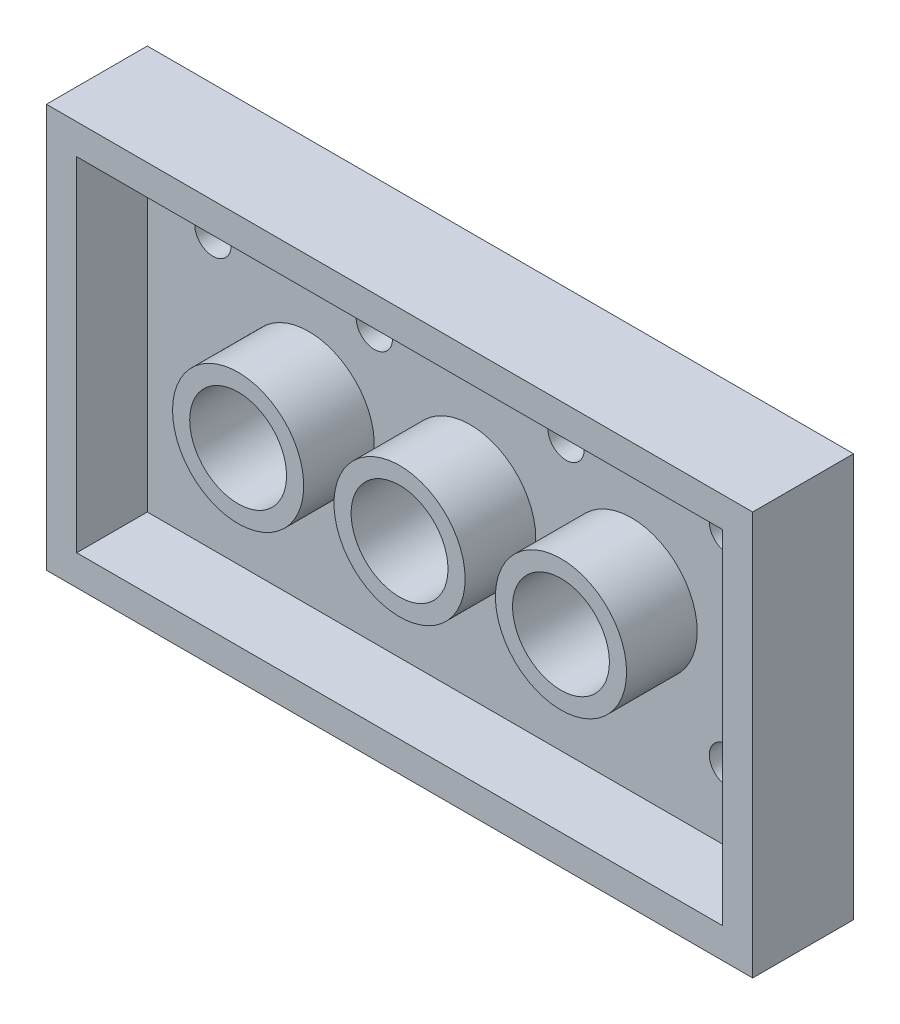
ISO-10303-21;
HEADER;
FILE_DESCRIPTION(('STEP AP214'),'2;1');
FILE_NAME('part.step','',(''),(''),'','','');
FILE_SCHEMA(('AUTOMOTIVE_DESIGN { 1 0 10303 214 1 1 1 1 }'));
ENDSEC;
DATA;
#1=APPLICATION_CONTEXT('core data for automotive mechanical design processes');
#2=APPLICATION_PROTOCOL_DEFINITION('international standard','automotive_design',2000,#1);
#3=PRODUCT_CONTEXT('',#1,'mechanical');
#4=PRODUCT('Part','Part','',(#3));
#5=PRODUCT_RELATED_PRODUCT_CATEGORY('part','',(#4));
#6=PRODUCT_DEFINITION_FORMATION('','',#4);
#7=PRODUCT_DEFINITION_CONTEXT('part definition',#1,'design');
#8=PRODUCT_DEFINITION('design','',#6,#7);
#9=PRODUCT_DEFINITION_SHAPE('','',#8);
#10=(LENGTH_UNIT() NAMED_UNIT(*) SI_UNIT(.MILLI.,.METRE.));
#11=(NAMED_UNIT(*) PLANE_ANGLE_UNIT() SI_UNIT($,.RADIAN.));
#12=(NAMED_UNIT(*) SI_UNIT($,.STERADIAN.) SOLID_ANGLE_UNIT());
#13=UNCERTAINTY_MEASURE_WITH_UNIT(LENGTH_MEASURE(1.E-05),#10,'distance_accuracy_value','');
#14=(GEOMETRIC_REPRESENTATION_CONTEXT(3) GLOBAL_UNCERTAINTY_ASSIGNED_CONTEXT((#13)) GLOBAL_UNIT_ASSIGNED_CONTEXT((#10,
#11,#12)) REPRESENTATION_CONTEXT('',''));
#15=CARTESIAN_POINT('',(0.,0.,0.));
#16=DIRECTION('',(0.,0.,1.));
#17=DIRECTION('',(1.,0.,0.));
#18=AXIS2_PLACEMENT_3D('',#15,#16,#17);
#19=CARTESIAN_POINT('',(0.,0.,1.5));
#20=DIRECTION('',(0.,0.,1.));
#21=DIRECTION('',(1.,0.,0.));
#22=AXIS2_PLACEMENT_3D('',#19,#20,#21);
#23=PLANE('',#22);
#24=CARTESIAN_POINT('',(-12.75,-4.99999999999999,1.5));
#25=DIRECTION('',(0.,0.,1.));
#26=DIRECTION('',(1.,0.,0.));
#27=AXIS2_PLACEMENT_3D('',#24,#25,#26);
#28=CIRCLE('',#27,0.9);
#29=CARTESIAN_POINT('',(-11.85,-4.99999999999999,1.5));
#30=VERTEX_POINT('',#29);
#31=EDGE_CURVE('E222',#30,#30,#28,.F.);
#32=ORIENTED_EDGE('',*,*,#31,.T.);
#33=EDGE_LOOP('',(#32));
#34=FACE_BOUND('',#33,.T.);
#35=CARTESIAN_POINT('',(-4.75,-5.,1.5));
#36=DIRECTION('',(0.,0.,1.));
#37=DIRECTION('',(1.,0.,0.));
#38=AXIS2_PLACEMENT_3D('',#35,#36,#37);
#39=CIRCLE('',#38,0.899999999999999);
#40=CARTESIAN_POINT('',(-3.85,-5.,1.5));
#41=VERTEX_POINT('',#40);
#42=EDGE_CURVE('E230',#41,#41,#39,.F.);
#43=ORIENTED_EDGE('',*,*,#42,.T.);
#44=EDGE_LOOP('',(#43));
#45=FACE_BOUND('',#44,.T.);
#46=CARTESIAN_POINT('',(4.75000000000001,5.,1.5));
#47=DIRECTION('',(0.,0.,-1.));
#48=DIRECTION('',(-1.,0.,0.));
#49=AXIS2_PLACEMENT_3D('',#46,#47,#48);
#50=CIRCLE('',#49,0.899999999999999);
#51=CARTESIAN_POINT('',(3.85000000000001,5.,1.5));
#52=VERTEX_POINT('',#51);
#53=EDGE_CURVE('E231',#52,#52,#50,.T.);
#54=ORIENTED_EDGE('',*,*,#53,.T.);
#55=EDGE_LOOP('',(#54));
#56=FACE_BOUND('',#55,.T.);
#57=CARTESIAN_POINT('',(12.75,5.,1.5));
#58=DIRECTION('',(0.,0.,1.));
#59=DIRECTION('',(1.,0.,0.));
#60=AXIS2_PLACEMENT_3D('',#57,#58,#59);
#61=CIRCLE('',#60,0.9);
#62=CARTESIAN_POINT('',(13.65,5.,1.5));
#63=VERTEX_POINT('',#62);
#64=EDGE_CURVE('E240',#63,#63,#61,.F.);
#65=ORIENTED_EDGE('',*,*,#64,.T.);
#66=EDGE_LOOP('',(#65));
#67=FACE_BOUND('',#66,.T.);
#68=CARTESIAN_POINT('',(-8.,0.,1.5));
#69=DIRECTION('',(0.,0.,1.));
#70=DIRECTION('',(-1.,0.,0.));
#71=AXIS2_PLACEMENT_3D('',#68,#69,#70);
#72=CIRCLE('',#71,3.25);
#73=CARTESIAN_POINT('',(-11.25,0.,1.5));
#74=VERTEX_POINT('',#73);
#75=EDGE_CURVE('E241',#74,#74,#72,.T.);
#76=ORIENTED_EDGE('',*,*,#75,.F.);
#77=EDGE_LOOP('',(#76));
#78=FACE_BOUND('',#77,.T.);
#79=CARTESIAN_POINT('',(8.,0.,1.5));
#80=DIRECTION('',(0.,0.,1.));
#81=DIRECTION('',(1.,0.,0.));
#82=AXIS2_PLACEMENT_3D('',#79,#80,#81);
#83=CIRCLE('',#82,3.25);
#84=CARTESIAN_POINT('',(11.25,0.,1.5));
#85=VERTEX_POINT('',#84);
#86=EDGE_CURVE('E244',#85,#85,#83,.T.);
#87=ORIENTED_EDGE('',*,*,#86,.F.);
#88=EDGE_LOOP('',(#87));
#89=FACE_BOUND('',#88,.T.);
#90=CARTESIAN_POINT('',(0.,0.,1.5));
#91=DIRECTION('',(0.,0.,1.));
#92=DIRECTION('',(1.,0.,0.));
#93=AXIS2_PLACEMENT_3D('',#90,#91,#92);
#94=CIRCLE('',#93,3.25);
#95=CARTESIAN_POINT('',(3.25,0.,1.5));
#96=VERTEX_POINT('',#95);
#97=EDGE_CURVE('E247',#96,#96,#94,.T.);
#98=ORIENTED_EDGE('',*,*,#97,.F.);
#99=EDGE_LOOP('',(#98));
#100=FACE_BOUND('',#99,.T.);
#101=DIRECTION('',(1.,0.,0.));
#102=VECTOR('',#101,1.);
#103=CARTESIAN_POINT('',(-16.,-8.5,1.5));
#104=LINE('',#103,#102);
#105=CARTESIAN_POINT('',(-16.,-8.5,1.5));
#106=VERTEX_POINT('',#105);
#107=CARTESIAN_POINT('',(16.,-8.5,1.5));
#108=VERTEX_POINT('',#107);
#109=EDGE_CURVE('E115',#106,#108,#104,.T.);
#110=ORIENTED_EDGE('',*,*,#109,.T.);
#111=DIRECTION('',(0.,1.,0.));
#112=VECTOR('',#111,1.);
#113=CARTESIAN_POINT('',(16.,-8.5,1.5));
#114=LINE('',#113,#112);
#115=CARTESIAN_POINT('',(16.,8.5,1.5));
#116=VERTEX_POINT('',#115);
#117=EDGE_CURVE('E119',#108,#116,#114,.T.);
#118=ORIENTED_EDGE('',*,*,#117,.T.);
#119=DIRECTION('',(-1.,0.,0.));
#120=VECTOR('',#119,1.);
#121=CARTESIAN_POINT('',(16.,8.5,1.5));
#122=LINE('',#121,#120);
#123=CARTESIAN_POINT('',(-16.,8.5,1.5));
#124=VERTEX_POINT('',#123);
#125=EDGE_CURVE('E57',#116,#124,#122,.T.);
#126=ORIENTED_EDGE('',*,*,#125,.T.);
#127=DIRECTION('',(0.,-1.,0.));
#128=VECTOR('',#127,1.);
#129=CARTESIAN_POINT('',(-16.,8.5,1.5));
#130=LINE('',#129,#128);
#131=EDGE_CURVE('E61',#124,#106,#130,.T.);
#132=ORIENTED_EDGE('',*,*,#131,.T.);
#133=EDGE_LOOP('',(#110,#118,#126,#132));
#134=FACE_BOUND('',#133,.T.);
#135=CARTESIAN_POINT('',(4.75000000000001,-5.,1.5));
#136=DIRECTION('',(0.,0.,1.));
#137=DIRECTION('',(1.,0.,0.));
#138=AXIS2_PLACEMENT_3D('',#135,#136,#137);
#139=CIRCLE('',#138,0.899999999999999);
#140=CARTESIAN_POINT('',(5.65000000000001,-5.,1.5));
#141=VERTEX_POINT('',#140);
#142=EDGE_CURVE('E511',#141,#141,#139,.T.);
#143=ORIENTED_EDGE('',*,*,#142,.F.);
#144=EDGE_LOOP('',(#143));
#145=FACE_BOUND('',#144,.T.);
#146=CARTESIAN_POINT('',(-4.74999999999999,5.,1.5));
#147=DIRECTION('',(0.,0.,1.));
#148=DIRECTION('',(1.,0.,0.));
#149=AXIS2_PLACEMENT_3D('',#146,#147,#148);
#150=CIRCLE('',#149,0.899999999999999);
#151=CARTESIAN_POINT('',(-3.84999999999999,5.,1.5));
#152=VERTEX_POINT('',#151);
#153=EDGE_CURVE('E506',#152,#152,#150,.T.);
#154=ORIENTED_EDGE('',*,*,#153,.F.);
#155=EDGE_LOOP('',(#154));
#156=FACE_BOUND('',#155,.T.);
#157=CARTESIAN_POINT('',(12.75,-5.,1.5));
#158=DIRECTION('',(0.,0.,1.));
#159=DIRECTION('',(1.,0.,0.));
#160=AXIS2_PLACEMENT_3D('',#157,#158,#159);
#161=CIRCLE('',#160,0.9);
#162=CARTESIAN_POINT('',(13.65,-5.,1.5));
#163=VERTEX_POINT('',#162);
#164=EDGE_CURVE('E502',#163,#163,#161,.T.);
#165=ORIENTED_EDGE('',*,*,#164,.F.);
#166=EDGE_LOOP('',(#165));
#167=FACE_BOUND('',#166,.T.);
#168=CARTESIAN_POINT('',(-12.75,5.00000000000001,1.5));
#169=DIRECTION('',(0.,0.,1.));
#170=DIRECTION('',(1.,0.,0.));
#171=AXIS2_PLACEMENT_3D('',#168,#169,#170);
#172=CIRCLE('',#171,0.9);
#173=CARTESIAN_POINT('',(-11.85,5.00000000000001,1.5));
#174=VERTEX_POINT('',#173);
#175=EDGE_CURVE('E518',#174,#174,#172,.T.);
#176=ORIENTED_EDGE('',*,*,#175,.F.);
#177=EDGE_LOOP('',(#176));
#178=FACE_BOUND('',#177,.T.);
#179=ADVANCED_FACE('F41',(#34,#45,#56,#67,#78,#89,#100,#134,#145,#156,#167,#178),#23,.T.);
#180=CARTESIAN_POINT('',(0.,0.,0.));
#181=DIRECTION('',(0.,0.,1.));
#182=DIRECTION('',(1.,0.,0.));
#183=AXIS2_PLACEMENT_3D('',#180,#181,#182);
#184=PLANE('',#183);
#185=CARTESIAN_POINT('',(4.75,-4.99999999999999,0.));
#186=DIRECTION('',(0.,0.,-1.));
#187=DIRECTION('',(-1.,0.,0.));
#188=AXIS2_PLACEMENT_3D('',#185,#186,#187);
#189=CIRCLE('',#188,2.4);
#190=CARTESIAN_POINT('',(2.35,-4.99999999999999,0.));
#191=VERTEX_POINT('',#190);
#192=EDGE_CURVE('E290',#191,#191,#189,.F.);
#193=ORIENTED_EDGE('',*,*,#192,.T.);
#194=EDGE_LOOP('',(#193));
#195=FACE_BOUND('',#194,.T.);
#196=CARTESIAN_POINT('',(-4.74999999999999,5.,0.));
#197=DIRECTION('',(0.,0.,1.));
#198=DIRECTION('',(1.,0.,0.));
#199=AXIS2_PLACEMENT_3D('',#196,#197,#198);
#200=CIRCLE('',#199,2.4);
#201=CARTESIAN_POINT('',(-2.34999999999999,5.,0.));
#202=VERTEX_POINT('',#201);
#203=EDGE_CURVE('E258',#202,#202,#200,.T.);
#204=ORIENTED_EDGE('',*,*,#203,.T.);
#205=EDGE_LOOP('',(#204));
#206=FACE_BOUND('',#205,.T.);
#207=CARTESIAN_POINT('',(-4.74999999999999,-5.,0.));
#208=DIRECTION('',(0.,0.,-1.));
#209=DIRECTION('',(-1.,0.,0.));
#210=AXIS2_PLACEMENT_3D('',#207,#208,#209);
#211=CIRCLE('',#210,2.4);
#212=CARTESIAN_POINT('',(-7.14999999999999,-5.,0.));
#213=VERTEX_POINT('',#212);
#214=EDGE_CURVE('E268',#213,#213,#211,.T.);
#215=ORIENTED_EDGE('',*,*,#214,.F.);
#216=EDGE_LOOP('',(#215));
#217=FACE_BOUND('',#216,.T.);
#218=CARTESIAN_POINT('',(12.75,5.00000000000002,0.));
#219=DIRECTION('',(0.,0.,-1.));
#220=DIRECTION('',(-1.,0.,0.));
#221=AXIS2_PLACEMENT_3D('',#218,#219,#220);
#222=CIRCLE('',#221,2.4);
#223=CARTESIAN_POINT('',(10.35,5.00000000000002,0.));
#224=VERTEX_POINT('',#223);
#225=EDGE_CURVE('E269',#224,#224,#222,.T.);
#226=ORIENTED_EDGE('',*,*,#225,.F.);
#227=EDGE_LOOP('',(#226));
#228=FACE_BOUND('',#227,.T.);
#229=CARTESIAN_POINT('',(-12.75,-5.,0.));
#230=DIRECTION('',(0.,0.,-1.));
#231=DIRECTION('',(-1.,0.,0.));
#232=AXIS2_PLACEMENT_3D('',#229,#230,#231);
#233=CIRCLE('',#232,2.4);
#234=CARTESIAN_POINT('',(-15.15,-5.,0.));
#235=VERTEX_POINT('',#234);
#236=EDGE_CURVE('E135',#235,#235,#233,.T.);
#237=ORIENTED_EDGE('',*,*,#236,.F.);
#238=EDGE_LOOP('',(#237));
#239=FACE_BOUND('',#238,.T.);
#240=DIRECTION('',(0.,1.,0.));
#241=VECTOR('',#240,1.);
#242=CARTESIAN_POINT('',(17.5,10.,0.));
#243=LINE('',#242,#241);
#244=CARTESIAN_POINT('',(17.5,-10.,0.));
#245=VERTEX_POINT('',#244);
#246=CARTESIAN_POINT('',(17.5,10.,0.));
#247=VERTEX_POINT('',#246);
#248=EDGE_CURVE('E149',#245,#247,#243,.T.);
#249=ORIENTED_EDGE('',*,*,#248,.F.);
#250=DIRECTION('',(1.,0.,0.));
#251=VECTOR('',#250,1.);
#252=CARTESIAN_POINT('',(-17.5,-10.,0.));
#253=LINE('',#252,#251);
#254=CARTESIAN_POINT('',(-17.5,-10.,0.));
#255=VERTEX_POINT('',#254);
#256=EDGE_CURVE('E153',#255,#245,#253,.T.);
#257=ORIENTED_EDGE('',*,*,#256,.F.);
#258=DIRECTION('',(0.,-1.,0.));
#259=VECTOR('',#258,1.);
#260=CARTESIAN_POINT('',(-17.5,10.,0.));
#261=LINE('',#260,#259);
#262=CARTESIAN_POINT('',(-17.5,10.,0.));
#263=VERTEX_POINT('',#262);
#264=EDGE_CURVE('E165',#263,#255,#261,.T.);
#265=ORIENTED_EDGE('',*,*,#264,.F.);
#266=DIRECTION('',(-1.,0.,0.));
#267=VECTOR('',#266,1.);
#268=CARTESIAN_POINT('',(-17.5,10.,0.));
#269=LINE('',#268,#267);
#270=EDGE_CURVE('E162',#247,#263,#269,.T.);
#271=ORIENTED_EDGE('',*,*,#270,.F.);
#272=EDGE_LOOP('',(#249,#257,#265,#271));
#273=FACE_BOUND('',#272,.T.);
#274=CARTESIAN_POINT('',(12.75,-4.99999999999998,0.));
#275=DIRECTION('',(0.,0.,-1.));
#276=DIRECTION('',(-1.,0.,0.));
#277=AXIS2_PLACEMENT_3D('',#274,#275,#276);
#278=CIRCLE('',#277,2.4);
#279=CARTESIAN_POINT('',(10.35,-4.99999999999998,0.));
#280=VERTEX_POINT('',#279);
#281=EDGE_CURVE('E295',#280,#280,#278,.F.);
#282=ORIENTED_EDGE('',*,*,#281,.T.);
#283=EDGE_LOOP('',(#282));
#284=FACE_BOUND('',#283,.T.);
#285=CARTESIAN_POINT('',(4.74999999999998,5.00000000000001,0.));
#286=DIRECTION('',(0.,0.,-1.));
#287=DIRECTION('',(-1.,0.,0.));
#288=AXIS2_PLACEMENT_3D('',#285,#286,#287);
#289=CIRCLE('',#288,2.4);
#290=CARTESIAN_POINT('',(2.34999999999998,5.00000000000001,0.));
#291=VERTEX_POINT('',#290);
#292=EDGE_CURVE('E179',#291,#291,#289,.T.);
#293=ORIENTED_EDGE('',*,*,#292,.F.);
#294=EDGE_LOOP('',(#293));
#295=FACE_BOUND('',#294,.T.);
#296=CARTESIAN_POINT('',(-12.75,5.,0.));
#297=DIRECTION('',(0.,0.,-1.));
#298=DIRECTION('',(-1.,0.,0.));
#299=AXIS2_PLACEMENT_3D('',#296,#297,#298);
#300=CIRCLE('',#299,2.4);
#301=CARTESIAN_POINT('',(-15.15,5.,0.));
#302=VERTEX_POINT('',#301);
#303=EDGE_CURVE('E126',#302,#302,#300,.F.);
#304=ORIENTED_EDGE('',*,*,#303,.T.);
#305=EDGE_LOOP('',(#304));
#306=FACE_BOUND('',#305,.T.);
#307=ADVANCED_FACE('F214',(#195,#206,#217,#228,#239,#273,#284,#295,#306),#184,.F.);
#308=CARTESIAN_POINT('',(0.,0.,5.));
#309=DIRECTION('',(0.,0.,1.));
#310=DIRECTION('',(1.,0.,0.));
#311=AXIS2_PLACEMENT_3D('',#308,#309,#310);
#312=PLANE('',#311);
#313=DIRECTION('',(0.,1.,0.));
#314=VECTOR('',#313,1.);
#315=CARTESIAN_POINT('',(17.5,10.,5.));
#316=LINE('',#315,#314);
#317=CARTESIAN_POINT('',(17.5,-10.,5.));
#318=VERTEX_POINT('',#317);
#319=CARTESIAN_POINT('',(17.5,10.,5.));
#320=VERTEX_POINT('',#319);
#321=EDGE_CURVE('E146',#318,#320,#316,.T.);
#322=ORIENTED_EDGE('',*,*,#321,.T.);
#323=DIRECTION('',(-1.,0.,0.));
#324=VECTOR('',#323,1.);
#325=CARTESIAN_POINT('',(-17.5,10.,5.));
#326=LINE('',#325,#324);
#327=CARTESIAN_POINT('',(-17.5,10.,5.));
#328=VERTEX_POINT('',#327);
#329=EDGE_CURVE('E155',#320,#328,#326,.T.);
#330=ORIENTED_EDGE('',*,*,#329,.T.);
#331=DIRECTION('',(0.,-1.,0.));
#332=VECTOR('',#331,1.);
#333=CARTESIAN_POINT('',(-17.5,10.,5.));
#334=LINE('',#333,#332);
#335=CARTESIAN_POINT('',(-17.5,-10.,5.));
#336=VERTEX_POINT('',#335);
#337=EDGE_CURVE('E154',#328,#336,#334,.T.);
#338=ORIENTED_EDGE('',*,*,#337,.T.);
#339=DIRECTION('',(1.,0.,0.));
#340=VECTOR('',#339,1.);
#341=CARTESIAN_POINT('',(-17.5,-10.,5.));
#342=LINE('',#341,#340);
#343=EDGE_CURVE('E156',#336,#318,#342,.T.);
#344=ORIENTED_EDGE('',*,*,#343,.T.);
#345=EDGE_LOOP('',(#322,#330,#338,#344));
#346=FACE_BOUND('',#345,.T.);
#347=DIRECTION('',(-1.,0.,0.));
#348=VECTOR('',#347,1.);
#349=CARTESIAN_POINT('',(-16.,8.5,5.));
#350=LINE('',#349,#348);
#351=CARTESIAN_POINT('',(16.,8.5,5.));
#352=VERTEX_POINT('',#351);
#353=CARTESIAN_POINT('',(-16.,8.5,5.));
#354=VERTEX_POINT('',#353);
#355=EDGE_CURVE('E140',#352,#354,#350,.T.);
#356=ORIENTED_EDGE('',*,*,#355,.F.);
#357=DIRECTION('',(0.,1.,0.));
#358=VECTOR('',#357,1.);
#359=CARTESIAN_POINT('',(16.,8.5,5.));
#360=LINE('',#359,#358);
#361=CARTESIAN_POINT('',(16.,-8.5,5.));
#362=VERTEX_POINT('',#361);
#363=EDGE_CURVE('E139',#362,#352,#360,.T.);
#364=ORIENTED_EDGE('',*,*,#363,.F.);
#365=DIRECTION('',(1.,0.,0.));
#366=VECTOR('',#365,1.);
#367=CARTESIAN_POINT('',(-16.,-8.5,5.));
#368=LINE('',#367,#366);
#369=CARTESIAN_POINT('',(-16.,-8.5,5.));
#370=VERTEX_POINT('',#369);
#371=EDGE_CURVE('E112',#370,#362,#368,.T.);
#372=ORIENTED_EDGE('',*,*,#371,.F.);
#373=DIRECTION('',(0.,-1.,0.));
#374=VECTOR('',#373,1.);
#375=CARTESIAN_POINT('',(-16.,8.5,5.));
#376=LINE('',#375,#374);
#377=EDGE_CURVE('E137',#354,#370,#376,.T.);
#378=ORIENTED_EDGE('',*,*,#377,.F.);
#379=EDGE_LOOP('',(#356,#364,#372,#378));
#380=FACE_BOUND('',#379,.T.);
#381=ADVANCED_FACE('F217',(#346,#380),#312,.T.);
#382=CARTESIAN_POINT('',(17.5,10.,5.));
#383=DIRECTION('',(-1.,0.,0.));
#384=DIRECTION('',(0.,0.,1.));
#385=AXIS2_PLACEMENT_3D('',#382,#383,#384);
#386=PLANE('',#385);
#387=ORIENTED_EDGE('',*,*,#248,.T.);
#388=DIRECTION('',(0.,0.,-1.));
#389=VECTOR('',#388,1.);
#390=CARTESIAN_POINT('',(17.5,10.,5.));
#391=LINE('',#390,#389);
#392=EDGE_CURVE('E174',#320,#247,#391,.T.);
#393=ORIENTED_EDGE('',*,*,#392,.F.);
#394=ORIENTED_EDGE('',*,*,#321,.F.);
#395=DIRECTION('',(0.,0.,-1.));
#396=VECTOR('',#395,1.);
#397=CARTESIAN_POINT('',(17.5,-10.,5.));
#398=LINE('',#397,#396);
#399=EDGE_CURVE('E158',#318,#245,#398,.T.);
#400=ORIENTED_EDGE('',*,*,#399,.T.);
#401=EDGE_LOOP('',(#387,#393,#394,#400));
#402=FACE_BOUND('',#401,.T.);
#403=ADVANCED_FACE('F43',(#402),#386,.F.);
#404=CARTESIAN_POINT('',(-17.5,10.,5.));
#405=DIRECTION('',(0.,-1.,0.));
#406=DIRECTION('',(0.,0.,-1.));
#407=AXIS2_PLACEMENT_3D('',#404,#405,#406);
#408=PLANE('',#407);
#409=ORIENTED_EDGE('',*,*,#270,.T.);
#410=DIRECTION('',(0.,0.,-1.));
#411=VECTOR('',#410,1.);
#412=CARTESIAN_POINT('',(-17.5,10.,5.));
#413=LINE('',#412,#411);
#414=EDGE_CURVE('E175',#328,#263,#413,.T.);
#415=ORIENTED_EDGE('',*,*,#414,.F.);
#416=ORIENTED_EDGE('',*,*,#329,.F.);
#417=ORIENTED_EDGE('',*,*,#392,.T.);
#418=EDGE_LOOP('',(#409,#415,#416,#417));
#419=FACE_BOUND('',#418,.T.);
#420=ADVANCED_FACE('F859',(#419),#408,.F.);
#421=CARTESIAN_POINT('',(-17.5,10.,5.));
#422=DIRECTION('',(1.,0.,0.));
#423=DIRECTION('',(0.,0.,-1.));
#424=AXIS2_PLACEMENT_3D('',#421,#422,#423);
#425=PLANE('',#424);
#426=ORIENTED_EDGE('',*,*,#264,.T.);
#427=DIRECTION('',(0.,0.,-1.));
#428=VECTOR('',#427,1.);
#429=CARTESIAN_POINT('',(-17.5,-10.,5.));
#430=LINE('',#429,#428);
#431=EDGE_CURVE('E169',#336,#255,#430,.T.);
#432=ORIENTED_EDGE('',*,*,#431,.F.);
#433=ORIENTED_EDGE('',*,*,#337,.F.);
#434=ORIENTED_EDGE('',*,*,#414,.T.);
#435=EDGE_LOOP('',(#426,#432,#433,#434));
#436=FACE_BOUND('',#435,.T.);
#437=ADVANCED_FACE('F849',(#436),#425,.F.);
#438=CARTESIAN_POINT('',(-17.5,-10.,5.));
#439=DIRECTION('',(0.,1.,0.));
#440=DIRECTION('',(0.,0.,1.));
#441=AXIS2_PLACEMENT_3D('',#438,#439,#440);
#442=PLANE('',#441);
#443=ORIENTED_EDGE('',*,*,#256,.T.);
#444=ORIENTED_EDGE('',*,*,#399,.F.);
#445=ORIENTED_EDGE('',*,*,#343,.F.);
#446=ORIENTED_EDGE('',*,*,#431,.T.);
#447=EDGE_LOOP('',(#443,#444,#445,#446));
#448=FACE_BOUND('',#447,.T.);
#449=ADVANCED_FACE('F845',(#448),#442,.F.);
#450=CARTESIAN_POINT('',(16.,8.5,5.));
#451=DIRECTION('',(-1.,0.,0.));
#452=DIRECTION('',(0.,0.,1.));
#453=AXIS2_PLACEMENT_3D('',#450,#451,#452);
#454=PLANE('',#453);
#455=ORIENTED_EDGE('',*,*,#117,.F.);
#456=DIRECTION('',(0.,0.,-1.));
#457=VECTOR('',#456,1.);
#458=CARTESIAN_POINT('',(16.,-8.5,5.));
#459=LINE('',#458,#457);
#460=EDGE_CURVE('E108',#362,#108,#459,.T.);
#461=ORIENTED_EDGE('',*,*,#460,.F.);
#462=ORIENTED_EDGE('',*,*,#363,.T.);
#463=DIRECTION('',(0.,0.,-1.));
#464=VECTOR('',#463,1.);
#465=CARTESIAN_POINT('',(16.,8.5,5.));
#466=LINE('',#465,#464);
#467=EDGE_CURVE('E125',#352,#116,#466,.T.);
#468=ORIENTED_EDGE('',*,*,#467,.T.);
#469=EDGE_LOOP('',(#455,#461,#462,#468));
#470=FACE_BOUND('',#469,.T.);
#471=ADVANCED_FACE('F122',(#470),#454,.T.);
#472=CARTESIAN_POINT('',(-16.,8.5,5.));
#473=DIRECTION('',(0.,-1.,0.));
#474=DIRECTION('',(0.,0.,-1.));
#475=AXIS2_PLACEMENT_3D('',#472,#473,#474);
#476=PLANE('',#475);
#477=ORIENTED_EDGE('',*,*,#125,.F.);
#478=ORIENTED_EDGE('',*,*,#467,.F.);
#479=ORIENTED_EDGE('',*,*,#355,.T.);
#480=DIRECTION('',(0.,0.,-1.));
#481=VECTOR('',#480,1.);
#482=CARTESIAN_POINT('',(-16.,8.5,5.));
#483=LINE('',#482,#481);
#484=EDGE_CURVE('E143',#354,#124,#483,.T.);
#485=ORIENTED_EDGE('',*,*,#484,.T.);
#486=EDGE_LOOP('',(#477,#478,#479,#485));
#487=FACE_BOUND('',#486,.T.);
#488=ADVANCED_FACE('F830',(#487),#476,.T.);
#489=CARTESIAN_POINT('',(-16.,8.5,5.));
#490=DIRECTION('',(1.,0.,0.));
#491=DIRECTION('',(0.,0.,-1.));
#492=AXIS2_PLACEMENT_3D('',#489,#490,#491);
#493=PLANE('',#492);
#494=ORIENTED_EDGE('',*,*,#131,.F.);
#495=ORIENTED_EDGE('',*,*,#484,.F.);
#496=ORIENTED_EDGE('',*,*,#377,.T.);
#497=DIRECTION('',(0.,0.,-1.));
#498=VECTOR('',#497,1.);
#499=CARTESIAN_POINT('',(-16.,-8.5,5.));
#500=LINE('',#499,#498);
#501=EDGE_CURVE('E120',#370,#106,#500,.T.);
#502=ORIENTED_EDGE('',*,*,#501,.T.);
#503=EDGE_LOOP('',(#494,#495,#496,#502));
#504=FACE_BOUND('',#503,.T.);
#505=ADVANCED_FACE('F328',(#504),#493,.T.);
#506=CARTESIAN_POINT('',(-16.,-8.5,5.));
#507=DIRECTION('',(0.,1.,0.));
#508=DIRECTION('',(0.,0.,1.));
#509=AXIS2_PLACEMENT_3D('',#506,#507,#508);
#510=PLANE('',#509);
#511=ORIENTED_EDGE('',*,*,#109,.F.);
#512=ORIENTED_EDGE('',*,*,#501,.F.);
#513=ORIENTED_EDGE('',*,*,#371,.T.);
#514=ORIENTED_EDGE('',*,*,#460,.T.);
#515=EDGE_LOOP('',(#511,#512,#513,#514));
#516=FACE_BOUND('',#515,.T.);
#517=ADVANCED_FACE('F109',(#516),#510,.T.);
#518=CARTESIAN_POINT('',(-12.75,-5.,-1.8));
#519=DIRECTION('',(0.,0.,1.));
#520=DIRECTION('',(1.,0.,0.));
#521=AXIS2_PLACEMENT_3D('',#518,#519,#520);
#522=CYLINDRICAL_SURFACE('',#521,2.4);
#523=CARTESIAN_POINT('',(-12.75,-5.,-1.8));
#524=DIRECTION('',(0.,0.,-1.));
#525=DIRECTION('',(-1.,0.,0.));
#526=AXIS2_PLACEMENT_3D('',#523,#524,#525);
#527=CIRCLE('',#526,2.4);
#528=CARTESIAN_POINT('',(-15.15,-5.,-1.8));
#529=VERTEX_POINT('',#528);
#530=EDGE_CURVE('E127',#529,#529,#527,.T.);
#531=ORIENTED_EDGE('',*,*,#530,.F.);
#532=EDGE_LOOP('',(#531));
#533=FACE_BOUND('',#532,.T.);
#534=ORIENTED_EDGE('',*,*,#236,.T.);
#535=EDGE_LOOP('',(#534));
#536=FACE_BOUND('',#535,.T.);
#537=ADVANCED_FACE('F322',(#533,#536),#522,.T.);
#538=CARTESIAN_POINT('',(0.,0.,-1.8));
#539=DIRECTION('',(0.,0.,-1.));
#540=DIRECTION('',(-1.,0.,0.));
#541=AXIS2_PLACEMENT_3D('',#538,#539,#540);
#542=PLANE('',#541);
#543=ORIENTED_EDGE('',*,*,#530,.T.);
#544=EDGE_LOOP('',(#543));
#545=FACE_BOUND('',#544,.T.);
#546=ADVANCED_FACE('F319',(#545),#542,.T.);
#547=CARTESIAN_POINT('',(12.75,5.00000000000002,-1.8));
#548=DIRECTION('',(0.,0.,1.));
#549=DIRECTION('',(1.,0.,0.));
#550=AXIS2_PLACEMENT_3D('',#547,#548,#549);
#551=CYLINDRICAL_SURFACE('',#550,2.4);
#552=CARTESIAN_POINT('',(12.75,5.00000000000002,-1.8));
#553=DIRECTION('',(0.,0.,-1.));
#554=DIRECTION('',(-1.,0.,0.));
#555=AXIS2_PLACEMENT_3D('',#552,#553,#554);
#556=CIRCLE('',#555,2.4);
#557=CARTESIAN_POINT('',(10.35,5.00000000000002,-1.8));
#558=VERTEX_POINT('',#557);
#559=EDGE_CURVE('E267',#558,#558,#556,.T.);
#560=ORIENTED_EDGE('',*,*,#559,.F.);
#561=EDGE_LOOP('',(#560));
#562=FACE_BOUND('',#561,.T.);
#563=ORIENTED_EDGE('',*,*,#225,.T.);
#564=EDGE_LOOP('',(#563));
#565=FACE_BOUND('',#564,.T.);
#566=ADVANCED_FACE('F318',(#562,#565),#551,.T.);
#567=CARTESIAN_POINT('',(0.,0.,-1.8));
#568=DIRECTION('',(0.,0.,-1.));
#569=DIRECTION('',(-1.,0.,0.));
#570=AXIS2_PLACEMENT_3D('',#567,#568,#569);
#571=PLANE('',#570);
#572=ORIENTED_EDGE('',*,*,#559,.T.);
#573=EDGE_LOOP('',(#572));
#574=FACE_BOUND('',#573,.T.);
#575=ADVANCED_FACE('F382',(#574),#571,.T.);
#576=CARTESIAN_POINT('',(-4.74999999999999,-5.,-1.8));
#577=DIRECTION('',(0.,0.,1.));
#578=DIRECTION('',(1.,0.,0.));
#579=AXIS2_PLACEMENT_3D('',#576,#577,#578);
#580=CYLINDRICAL_SURFACE('',#579,2.4);
#581=CARTESIAN_POINT('',(-4.74999999999999,-5.,-1.8));
#582=DIRECTION('',(0.,0.,-1.));
#583=DIRECTION('',(-1.,0.,0.));
#584=AXIS2_PLACEMENT_3D('',#581,#582,#583);
#585=CIRCLE('',#584,2.4);
#586=CARTESIAN_POINT('',(-7.14999999999999,-5.,-1.8));
#587=VERTEX_POINT('',#586);
#588=EDGE_CURVE('E263',#587,#587,#585,.T.);
#589=ORIENTED_EDGE('',*,*,#588,.F.);
#590=EDGE_LOOP('',(#589));
#591=FACE_BOUND('',#590,.T.);
#592=ORIENTED_EDGE('',*,*,#214,.T.);
#593=EDGE_LOOP('',(#592));
#594=FACE_BOUND('',#593,.T.);
#595=ADVANCED_FACE('F390',(#591,#594),#580,.T.);
#596=CARTESIAN_POINT('',(-4.74999999999999,-5.,-1.8));
#597=DIRECTION('',(0.,0.,-1.));
#598=DIRECTION('',(-1.,0.,0.));
#599=AXIS2_PLACEMENT_3D('',#596,#597,#598);
#600=PLANE('',#599);
#601=ORIENTED_EDGE('',*,*,#588,.T.);
#602=EDGE_LOOP('',(#601));
#603=FACE_BOUND('',#602,.T.);
#604=ADVANCED_FACE('F363',(#603),#600,.T.);
#605=CARTESIAN_POINT('',(-4.74999999999999,5.,-1.8));
#606=DIRECTION('',(0.,0.,1.));
#607=DIRECTION('',(1.,0.,0.));
#608=AXIS2_PLACEMENT_3D('',#605,#606,#607);
#609=CYLINDRICAL_SURFACE('',#608,2.4);
#610=CARTESIAN_POINT('',(-4.74999999999999,5.,-1.8));
#611=DIRECTION('',(0.,0.,1.));
#612=DIRECTION('',(1.,0.,0.));
#613=AXIS2_PLACEMENT_3D('',#610,#611,#612);
#614=CIRCLE('',#613,2.4);
#615=CARTESIAN_POINT('',(-2.34999999999999,5.,-1.8));
#616=VERTEX_POINT('',#615);
#617=EDGE_CURVE('E251',#616,#616,#614,.T.);
#618=ORIENTED_EDGE('',*,*,#617,.T.);
#619=EDGE_LOOP('',(#618));
#620=FACE_BOUND('',#619,.T.);
#621=ORIENTED_EDGE('',*,*,#203,.F.);
#622=EDGE_LOOP('',(#621));
#623=FACE_BOUND('',#622,.T.);
#624=ADVANCED_FACE('F400',(#620,#623),#609,.T.);
#625=CARTESIAN_POINT('',(-4.74999999999999,5.,-1.8));
#626=DIRECTION('',(0.,0.,1.));
#627=DIRECTION('',(1.,0.,0.));
#628=AXIS2_PLACEMENT_3D('',#625,#626,#627);
#629=PLANE('',#628);
#630=ORIENTED_EDGE('',*,*,#617,.F.);
#631=EDGE_LOOP('',(#630));
#632=FACE_BOUND('',#631,.T.);
#633=ADVANCED_FACE('F313',(#632),#629,.F.);
#634=CARTESIAN_POINT('',(12.75,-4.99999999999998,-1.8));
#635=DIRECTION('',(0.,0.,1.));
#636=DIRECTION('',(1.,0.,0.));
#637=AXIS2_PLACEMENT_3D('',#634,#635,#636);
#638=CYLINDRICAL_SURFACE('',#637,2.4);
#639=CARTESIAN_POINT('',(12.75,-4.99999999999998,-1.8));
#640=DIRECTION('',(0.,0.,-1.));
#641=DIRECTION('',(-1.,0.,0.));
#642=AXIS2_PLACEMENT_3D('',#639,#640,#641);
#643=CIRCLE('',#642,2.4);
#644=CARTESIAN_POINT('',(10.35,-4.99999999999998,-1.8));
#645=VERTEX_POINT('',#644);
#646=EDGE_CURVE('E271',#645,#645,#643,.F.);
#647=ORIENTED_EDGE('',*,*,#646,.T.);
#648=EDGE_LOOP('',(#647));
#649=FACE_BOUND('',#648,.T.);
#650=ORIENTED_EDGE('',*,*,#281,.F.);
#651=EDGE_LOOP('',(#650));
#652=FACE_BOUND('',#651,.T.);
#653=ADVANCED_FACE('F297',(#649,#652),#638,.T.);
#654=CARTESIAN_POINT('',(0.,0.,-1.8));
#655=DIRECTION('',(0.,0.,-1.));
#656=DIRECTION('',(-1.,0.,0.));
#657=AXIS2_PLACEMENT_3D('',#654,#655,#656);
#658=PLANE('',#657);
#659=ORIENTED_EDGE('',*,*,#646,.F.);
#660=EDGE_LOOP('',(#659));
#661=FACE_BOUND('',#660,.T.);
#662=ADVANCED_FACE('F303',(#661),#658,.T.);
#663=CARTESIAN_POINT('',(4.75,-4.99999999999999,-1.8));
#664=DIRECTION('',(0.,0.,1.));
#665=DIRECTION('',(1.,0.,0.));
#666=AXIS2_PLACEMENT_3D('',#663,#664,#665);
#667=CYLINDRICAL_SURFACE('',#666,2.4);
#668=CARTESIAN_POINT('',(4.75,-4.99999999999999,-1.8));
#669=DIRECTION('',(0.,0.,-1.));
#670=DIRECTION('',(-1.,0.,0.));
#671=AXIS2_PLACEMENT_3D('',#668,#669,#670);
#672=CIRCLE('',#671,2.4);
#673=CARTESIAN_POINT('',(2.35,-4.99999999999999,-1.8));
#674=VERTEX_POINT('',#673);
#675=EDGE_CURVE('E293',#674,#674,#672,.F.);
#676=ORIENTED_EDGE('',*,*,#675,.T.);
#677=EDGE_LOOP('',(#676));
#678=FACE_BOUND('',#677,.T.);
#679=ORIENTED_EDGE('',*,*,#192,.F.);
#680=EDGE_LOOP('',(#679));
#681=FACE_BOUND('',#680,.T.);
#682=ADVANCED_FACE('F304',(#678,#681),#667,.T.);
#683=CARTESIAN_POINT('',(0.,0.,-1.8));
#684=DIRECTION('',(0.,0.,-1.));
#685=DIRECTION('',(-1.,0.,0.));
#686=AXIS2_PLACEMENT_3D('',#683,#684,#685);
#687=PLANE('',#686);
#688=ORIENTED_EDGE('',*,*,#675,.F.);
#689=EDGE_LOOP('',(#688));
#690=FACE_BOUND('',#689,.T.);
#691=ADVANCED_FACE('F311',(#690),#687,.T.);
#692=CARTESIAN_POINT('',(4.74999999999998,5.00000000000001,-1.8));
#693=DIRECTION('',(0.,0.,1.));
#694=DIRECTION('',(1.,0.,0.));
#695=AXIS2_PLACEMENT_3D('',#692,#693,#694);
#696=CYLINDRICAL_SURFACE('',#695,2.4);
#697=CARTESIAN_POINT('',(4.74999999999998,5.00000000000001,-1.8));
#698=DIRECTION('',(0.,0.,-1.));
#699=DIRECTION('',(-1.,0.,0.));
#700=AXIS2_PLACEMENT_3D('',#697,#698,#699);
#701=CIRCLE('',#700,2.4);
#702=CARTESIAN_POINT('',(2.34999999999998,5.00000000000001,-1.8));
#703=VERTEX_POINT('',#702);
#704=EDGE_CURVE('E283',#703,#703,#701,.T.);
#705=ORIENTED_EDGE('',*,*,#704,.F.);
#706=EDGE_LOOP('',(#705));
#707=FACE_BOUND('',#706,.T.);
#708=ORIENTED_EDGE('',*,*,#292,.T.);
#709=EDGE_LOOP('',(#708));
#710=FACE_BOUND('',#709,.T.);
#711=ADVANCED_FACE('F357',(#707,#710),#696,.T.);
#712=CARTESIAN_POINT('',(0.,0.,-1.8));
#713=DIRECTION('',(0.,0.,-1.));
#714=DIRECTION('',(-1.,0.,0.));
#715=AXIS2_PLACEMENT_3D('',#712,#713,#714);
#716=PLANE('',#715);
#717=ORIENTED_EDGE('',*,*,#704,.T.);
#718=EDGE_LOOP('',(#717));
#719=FACE_BOUND('',#718,.T.);
#720=ADVANCED_FACE('F350',(#719),#716,.T.);
#721=CARTESIAN_POINT('',(-12.75,5.,-1.8));
#722=DIRECTION('',(0.,0.,1.));
#723=DIRECTION('',(1.,0.,0.));
#724=AXIS2_PLACEMENT_3D('',#721,#722,#723);
#725=CYLINDRICAL_SURFACE('',#724,2.4);
#726=CARTESIAN_POINT('',(-12.75,5.,-1.8));
#727=DIRECTION('',(0.,0.,-1.));
#728=DIRECTION('',(-1.,0.,0.));
#729=AXIS2_PLACEMENT_3D('',#726,#727,#728);
#730=CIRCLE('',#729,2.4);
#731=CARTESIAN_POINT('',(-15.15,5.,-1.8));
#732=VERTEX_POINT('',#731);
#733=EDGE_CURVE('E278',#732,#732,#730,.F.);
#734=ORIENTED_EDGE('',*,*,#733,.T.);
#735=EDGE_LOOP('',(#734));
#736=FACE_BOUND('',#735,.T.);
#737=ORIENTED_EDGE('',*,*,#303,.F.);
#738=EDGE_LOOP('',(#737));
#739=FACE_BOUND('',#738,.T.);
#740=ADVANCED_FACE('F341',(#736,#739),#725,.T.);
#741=CARTESIAN_POINT('',(0.,0.,-1.8));
#742=DIRECTION('',(0.,0.,-1.));
#743=DIRECTION('',(-1.,0.,0.));
#744=AXIS2_PLACEMENT_3D('',#741,#742,#743);
#745=PLANE('',#744);
#746=ORIENTED_EDGE('',*,*,#733,.F.);
#747=EDGE_LOOP('',(#746));
#748=FACE_BOUND('',#747,.T.);
#749=ADVANCED_FACE('F346',(#748),#745,.T.);
#750=CARTESIAN_POINT('',(0.,0.,5.));
#751=DIRECTION('',(0.,0.,1.));
#752=DIRECTION('',(1.,0.,0.));
#753=AXIS2_PLACEMENT_3D('',#750,#751,#752);
#754=PLANE('',#753);
#755=CARTESIAN_POINT('',(0.,0.,5.));
#756=DIRECTION('',(0.,0.,1.));
#757=DIRECTION('',(1.,0.,0.));
#758=AXIS2_PLACEMENT_3D('',#755,#756,#757);
#759=CIRCLE('',#758,3.25);
#760=CARTESIAN_POINT('',(3.25,0.,5.));
#761=VERTEX_POINT('',#760);
#762=EDGE_CURVE('E249',#761,#761,#759,.T.);
#763=ORIENTED_EDGE('',*,*,#762,.T.);
#764=EDGE_LOOP('',(#763));
#765=FACE_BOUND('',#764,.T.);
#766=CARTESIAN_POINT('',(0.,0.,5.));
#767=DIRECTION('',(0.,0.,1.));
#768=DIRECTION('',(1.,0.,0.));
#769=AXIS2_PLACEMENT_3D('',#766,#767,#768);
#770=CIRCLE('',#769,2.4);
#771=CARTESIAN_POINT('',(2.4,0.,5.));
#772=VERTEX_POINT('',#771);
#773=EDGE_CURVE('E252',#772,#772,#770,.T.);
#774=ORIENTED_EDGE('',*,*,#773,.F.);
#775=EDGE_LOOP('',(#774));
#776=FACE_BOUND('',#775,.T.);
#777=ADVANCED_FACE('F353',(#765,#776),#754,.T.);
#778=CARTESIAN_POINT('',(0.,0.,5.));
#779=DIRECTION('',(0.,0.,-1.));
#780=DIRECTION('',(-1.,0.,0.));
#781=AXIS2_PLACEMENT_3D('',#778,#779,#780);
#782=CYLINDRICAL_SURFACE('',#781,3.25);
#783=ORIENTED_EDGE('',*,*,#762,.F.);
#784=EDGE_LOOP('',(#783));
#785=FACE_BOUND('',#784,.T.);
#786=ORIENTED_EDGE('',*,*,#97,.T.);
#787=EDGE_LOOP('',(#786));
#788=FACE_BOUND('',#787,.T.);
#789=ADVANCED_FACE('F415',(#785,#788),#782,.T.);
#790=CARTESIAN_POINT('',(0.,0.,5.));
#791=DIRECTION('',(0.,0.,-1.));
#792=DIRECTION('',(-1.,0.,0.));
#793=AXIS2_PLACEMENT_3D('',#790,#791,#792);
#794=CYLINDRICAL_SURFACE('',#793,2.4);
#795=ORIENTED_EDGE('',*,*,#773,.T.);
#796=EDGE_LOOP('',(#795));
#797=FACE_BOUND('',#796,.T.);
#798=CARTESIAN_POINT('',(0.,0.,1.5));
#799=DIRECTION('',(0.,0.,1.));
#800=DIRECTION('',(1.,0.,0.));
#801=AXIS2_PLACEMENT_3D('',#798,#799,#800);
#802=CIRCLE('',#801,2.4);
#803=CARTESIAN_POINT('',(2.4,0.,1.5));
#804=VERTEX_POINT('',#803);
#805=EDGE_CURVE('E178',#804,#804,#802,.F.);
#806=ORIENTED_EDGE('',*,*,#805,.T.);
#807=EDGE_LOOP('',(#806));
#808=FACE_BOUND('',#807,.T.);
#809=ADVANCED_FACE('F207',(#797,#808),#794,.F.);
#810=ORIENTED_EDGE('',*,*,#805,.F.);
#811=EDGE_LOOP('',(#810));
#812=FACE_BOUND('',#811,.T.);
#813=ADVANCED_FACE('F188',(#812),#23,.T.);
#814=CARTESIAN_POINT('',(8.,0.,5.));
#815=DIRECTION('',(0.,0.,1.));
#816=DIRECTION('',(1.,0.,0.));
#817=AXIS2_PLACEMENT_3D('',#814,#815,#816);
#818=PLANE('',#817);
#819=CARTESIAN_POINT('',(8.,0.,5.));
#820=DIRECTION('',(0.,0.,1.));
#821=DIRECTION('',(1.,0.,0.));
#822=AXIS2_PLACEMENT_3D('',#819,#820,#821);
#823=CIRCLE('',#822,3.25);
#824=CARTESIAN_POINT('',(11.25,0.,5.));
#825=VERTEX_POINT('',#824);
#826=EDGE_CURVE('E545',#825,#825,#823,.T.);
#827=ORIENTED_EDGE('',*,*,#826,.T.);
#828=EDGE_LOOP('',(#827));
#829=FACE_BOUND('',#828,.T.);
#830=CARTESIAN_POINT('',(8.,0.,5.));
#831=DIRECTION('',(0.,0.,1.));
#832=DIRECTION('',(1.,0.,0.));
#833=AXIS2_PLACEMENT_3D('',#830,#831,#832);
#834=CIRCLE('',#833,2.4);
#835=CARTESIAN_POINT('',(10.4,0.,5.));
#836=VERTEX_POINT('',#835);
#837=EDGE_CURVE('E260',#836,#836,#834,.T.);
#838=ORIENTED_EDGE('',*,*,#837,.F.);
#839=EDGE_LOOP('',(#838));
#840=FACE_BOUND('',#839,.T.);
#841=ADVANCED_FACE('F202',(#829,#840),#818,.T.);
#842=CARTESIAN_POINT('',(8.,0.,5.));
#843=DIRECTION('',(0.,0.,-1.));
#844=DIRECTION('',(-1.,0.,0.));
#845=AXIS2_PLACEMENT_3D('',#842,#843,#844);
#846=CYLINDRICAL_SURFACE('',#845,3.25);
#847=ORIENTED_EDGE('',*,*,#826,.F.);
#848=EDGE_LOOP('',(#847));
#849=FACE_BOUND('',#848,.T.);
#850=ORIENTED_EDGE('',*,*,#86,.T.);
#851=EDGE_LOOP('',(#850));
#852=FACE_BOUND('',#851,.T.);
#853=ADVANCED_FACE('F197',(#849,#852),#846,.T.);
#854=CARTESIAN_POINT('',(8.,0.,5.));
#855=DIRECTION('',(0.,0.,-1.));
#856=DIRECTION('',(-1.,0.,0.));
#857=AXIS2_PLACEMENT_3D('',#854,#855,#856);
#858=CYLINDRICAL_SURFACE('',#857,2.4);
#859=ORIENTED_EDGE('',*,*,#837,.T.);
#860=EDGE_LOOP('',(#859));
#861=FACE_BOUND('',#860,.T.);
#862=CARTESIAN_POINT('',(8.,0.,1.5));
#863=DIRECTION('',(0.,0.,1.));
#864=DIRECTION('',(1.,0.,0.));
#865=AXIS2_PLACEMENT_3D('',#862,#863,#864);
#866=CIRCLE('',#865,2.4);
#867=CARTESIAN_POINT('',(10.4,0.,1.5));
#868=VERTEX_POINT('',#867);
#869=EDGE_CURVE('E47',#868,#868,#866,.F.);
#870=ORIENTED_EDGE('',*,*,#869,.T.);
#871=EDGE_LOOP('',(#870));
#872=FACE_BOUND('',#871,.T.);
#873=ADVANCED_FACE('F183',(#861,#872),#858,.F.);
#874=ORIENTED_EDGE('',*,*,#869,.F.);
#875=EDGE_LOOP('',(#874));
#876=FACE_BOUND('',#875,.T.);
#877=ADVANCED_FACE('F187',(#876),#23,.T.);
#878=CARTESIAN_POINT('',(-8.,0.,5.));
#879=DIRECTION('',(0.,0.,-1.));
#880=DIRECTION('',(-1.,0.,0.));
#881=AXIS2_PLACEMENT_3D('',#878,#879,#880);
#882=PLANE('',#881);
#883=CARTESIAN_POINT('',(-8.,0.,5.));
#884=DIRECTION('',(0.,0.,1.));
#885=DIRECTION('',(-1.,0.,0.));
#886=AXIS2_PLACEMENT_3D('',#883,#884,#885);
#887=CIRCLE('',#886,3.25);
#888=CARTESIAN_POINT('',(-11.25,0.,5.));
#889=VERTEX_POINT('',#888);
#890=EDGE_CURVE('E536',#889,#889,#887,.T.);
#891=ORIENTED_EDGE('',*,*,#890,.T.);
#892=EDGE_LOOP('',(#891));
#893=FACE_BOUND('',#892,.T.);
#894=CARTESIAN_POINT('',(-8.,0.,5.));
#895=DIRECTION('',(0.,0.,1.));
#896=DIRECTION('',(-1.,0.,0.));
#897=AXIS2_PLACEMENT_3D('',#894,#895,#896);
#898=CIRCLE('',#897,2.4);
#899=CARTESIAN_POINT('',(-10.4,0.,5.));
#900=VERTEX_POINT('',#899);
#901=EDGE_CURVE('E544',#900,#900,#898,.T.);
#902=ORIENTED_EDGE('',*,*,#901,.F.);
#903=EDGE_LOOP('',(#902));
#904=FACE_BOUND('',#903,.T.);
#905=ADVANCED_FACE('F189',(#893,#904),#882,.F.);
#906=CARTESIAN_POINT('',(-8.,0.,5.));
#907=DIRECTION('',(0.,0.,-1.));
#908=DIRECTION('',(-1.,0.,0.));
#909=AXIS2_PLACEMENT_3D('',#906,#907,#908);
#910=CYLINDRICAL_SURFACE('',#909,3.25);
#911=ORIENTED_EDGE('',*,*,#890,.F.);
#912=EDGE_LOOP('',(#911));
#913=FACE_BOUND('',#912,.T.);
#914=ORIENTED_EDGE('',*,*,#75,.T.);
#915=EDGE_LOOP('',(#914));
#916=FACE_BOUND('',#915,.T.);
#917=ADVANCED_FACE('F196',(#913,#916),#910,.T.);
#918=CARTESIAN_POINT('',(-8.,0.,5.));
#919=DIRECTION('',(0.,0.,-1.));
#920=DIRECTION('',(-1.,0.,0.));
#921=AXIS2_PLACEMENT_3D('',#918,#919,#920);
#922=CYLINDRICAL_SURFACE('',#921,2.4);
#923=ORIENTED_EDGE('',*,*,#901,.T.);
#924=EDGE_LOOP('',(#923));
#925=FACE_BOUND('',#924,.T.);
#926=CARTESIAN_POINT('',(-8.,0.,1.5));
#927=DIRECTION('',(0.,0.,1.));
#928=DIRECTION('',(1.,0.,0.));
#929=AXIS2_PLACEMENT_3D('',#926,#927,#928);
#930=CIRCLE('',#929,2.4);
#931=CARTESIAN_POINT('',(-5.6,0.,1.5));
#932=VERTEX_POINT('',#931);
#933=EDGE_CURVE('E11',#932,#932,#930,.F.);
#934=ORIENTED_EDGE('',*,*,#933,.T.);
#935=EDGE_LOOP('',(#934));
#936=FACE_BOUND('',#935,.T.);
#937=ADVANCED_FACE('F208',(#925,#936),#922,.F.);
#938=ORIENTED_EDGE('',*,*,#933,.F.);
#939=EDGE_LOOP('',(#938));
#940=FACE_BOUND('',#939,.T.);
#941=ADVANCED_FACE('F192',(#940),#23,.T.);
#942=CARTESIAN_POINT('',(12.75,5.,-0.3));
#943=DIRECTION('',(0.,0.,1.));
#944=DIRECTION('',(1.,0.,0.));
#945=AXIS2_PLACEMENT_3D('',#942,#943,#944);
#946=CYLINDRICAL_SURFACE('',#945,0.9);
#947=CARTESIAN_POINT('',(12.75,5.,-0.3));
#948=DIRECTION('',(0.,0.,1.));
#949=DIRECTION('',(1.,0.,0.));
#950=AXIS2_PLACEMENT_3D('',#947,#948,#949);
#951=CIRCLE('',#950,0.9);
#952=CARTESIAN_POINT('',(13.65,5.,-0.3));
#953=VERTEX_POINT('',#952);
#954=EDGE_CURVE('E537',#953,#953,#951,.F.);
#955=ORIENTED_EDGE('',*,*,#954,.T.);
#956=EDGE_LOOP('',(#955));
#957=FACE_BOUND('',#956,.T.);
#958=ORIENTED_EDGE('',*,*,#64,.F.);
#959=EDGE_LOOP('',(#958));
#960=FACE_BOUND('',#959,.T.);
#961=ADVANCED_FACE('F209',(#957,#960),#946,.F.);
#962=CARTESIAN_POINT('',(0.,0.,-0.3));
#963=DIRECTION('',(0.,0.,1.));
#964=DIRECTION('',(1.,0.,0.));
#965=AXIS2_PLACEMENT_3D('',#962,#963,#964);
#966=PLANE('',#965);
#967=ORIENTED_EDGE('',*,*,#954,.F.);
#968=EDGE_LOOP('',(#967));
#969=FACE_BOUND('',#968,.T.);
#970=ADVANCED_FACE('F434',(#969),#966,.T.);
#971=CARTESIAN_POINT('',(4.75000000000001,-5.,-0.3));
#972=DIRECTION('',(0.,0.,1.));
#973=DIRECTION('',(1.,0.,0.));
#974=AXIS2_PLACEMENT_3D('',#971,#972,#973);
#975=CYLINDRICAL_SURFACE('',#974,0.899999999999999);
#976=CARTESIAN_POINT('',(4.75000000000001,-5.,-0.3));
#977=DIRECTION('',(0.,0.,1.));
#978=DIRECTION('',(1.,0.,0.));
#979=AXIS2_PLACEMENT_3D('',#976,#977,#978);
#980=CIRCLE('',#979,0.899999999999999);
#981=CARTESIAN_POINT('',(5.65000000000001,-5.,-0.3));
#982=VERTEX_POINT('',#981);
#983=EDGE_CURVE('E520',#982,#982,#980,.T.);
#984=ORIENTED_EDGE('',*,*,#983,.F.);
#985=EDGE_LOOP('',(#984));
#986=FACE_BOUND('',#985,.T.);
#987=ORIENTED_EDGE('',*,*,#142,.T.);
#988=EDGE_LOOP('',(#987));
#989=FACE_BOUND('',#988,.T.);
#990=ADVANCED_FACE('F437',(#986,#989),#975,.F.);
#991=CARTESIAN_POINT('',(4.75000000000001,-5.,-0.3));
#992=DIRECTION('',(0.,0.,1.));
#993=DIRECTION('',(1.,0.,0.));
#994=AXIS2_PLACEMENT_3D('',#991,#992,#993);
#995=PLANE('',#994);
#996=ORIENTED_EDGE('',*,*,#983,.T.);
#997=EDGE_LOOP('',(#996));
#998=FACE_BOUND('',#997,.T.);
#999=ADVANCED_FACE('F471',(#998),#995,.T.);
#1000=CARTESIAN_POINT('',(-4.74999999999999,5.,-0.3));
#1001=DIRECTION('',(0.,0.,1.));
#1002=DIRECTION('',(1.,0.,0.));
#1003=AXIS2_PLACEMENT_3D('',#1000,#1001,#1002);
#1004=CYLINDRICAL_SURFACE('',#1003,0.899999999999999);
#1005=CARTESIAN_POINT('',(-4.74999999999999,5.,-0.3));
#1006=DIRECTION('',(0.,0.,1.));
#1007=DIRECTION('',(1.,0.,0.));
#1008=AXIS2_PLACEMENT_3D('',#1005,#1006,#1007);
#1009=CIRCLE('',#1008,0.899999999999999);
#1010=CARTESIAN_POINT('',(-3.84999999999999,5.,-0.3));
#1011=VERTEX_POINT('',#1010);
#1012=EDGE_CURVE('E512',#1011,#1011,#1009,.T.);
#1013=ORIENTED_EDGE('',*,*,#1012,.F.);
#1014=EDGE_LOOP('',(#1013));
#1015=FACE_BOUND('',#1014,.T.);
#1016=ORIENTED_EDGE('',*,*,#153,.T.);
#1017=EDGE_LOOP('',(#1016));
#1018=FACE_BOUND('',#1017,.T.);
#1019=ADVANCED_FACE('F480',(#1015,#1018),#1004,.F.);
#1020=CARTESIAN_POINT('',(-4.74999999999999,5.,-0.3));
#1021=DIRECTION('',(0.,0.,1.));
#1022=DIRECTION('',(1.,0.,0.));
#1023=AXIS2_PLACEMENT_3D('',#1020,#1021,#1022);
#1024=PLANE('',#1023);
#1025=ORIENTED_EDGE('',*,*,#1012,.T.);
#1026=EDGE_LOOP('',(#1025));
#1027=FACE_BOUND('',#1026,.T.);
#1028=ADVANCED_FACE('F481',(#1027),#1024,.T.);
#1029=CARTESIAN_POINT('',(4.75000000000001,5.,-0.3));
#1030=DIRECTION('',(0.,0.,1.));
#1031=DIRECTION('',(1.,0.,0.));
#1032=AXIS2_PLACEMENT_3D('',#1029,#1030,#1031);
#1033=CYLINDRICAL_SURFACE('',#1032,0.899999999999999);
#1034=CARTESIAN_POINT('',(4.75000000000001,5.,-0.3));
#1035=DIRECTION('',(0.,0.,-1.));
#1036=DIRECTION('',(-1.,0.,0.));
#1037=AXIS2_PLACEMENT_3D('',#1034,#1035,#1036);
#1038=CIRCLE('',#1037,0.899999999999999);
#1039=CARTESIAN_POINT('',(3.85000000000001,5.,-0.3));
#1040=VERTEX_POINT('',#1039);
#1041=EDGE_CURVE('E499',#1040,#1040,#1038,.T.);
#1042=ORIENTED_EDGE('',*,*,#1041,.T.);
#1043=EDGE_LOOP('',(#1042));
#1044=FACE_BOUND('',#1043,.T.);
#1045=ORIENTED_EDGE('',*,*,#53,.F.);
#1046=EDGE_LOOP('',(#1045));
#1047=FACE_BOUND('',#1046,.T.);
#1048=ADVANCED_FACE('F482',(#1044,#1047),#1033,.F.);
#1049=CARTESIAN_POINT('',(4.75000000000001,5.,-0.3));
#1050=DIRECTION('',(0.,0.,-1.));
#1051=DIRECTION('',(-1.,0.,0.));
#1052=AXIS2_PLACEMENT_3D('',#1049,#1050,#1051);
#1053=PLANE('',#1052);
#1054=ORIENTED_EDGE('',*,*,#1041,.F.);
#1055=EDGE_LOOP('',(#1054));
#1056=FACE_BOUND('',#1055,.T.);
#1057=ADVANCED_FACE('F446',(#1056),#1053,.F.);
#1058=CARTESIAN_POINT('',(12.75,-5.,-0.3));
#1059=DIRECTION('',(0.,0.,1.));
#1060=DIRECTION('',(1.,0.,0.));
#1061=AXIS2_PLACEMENT_3D('',#1058,#1059,#1060);
#1062=CYLINDRICAL_SURFACE('',#1061,0.9);
#1063=CARTESIAN_POINT('',(12.75,-5.,-0.3));
#1064=DIRECTION('',(0.,0.,1.));
#1065=DIRECTION('',(1.,0.,0.));
#1066=AXIS2_PLACEMENT_3D('',#1063,#1064,#1065);
#1067=CIRCLE('',#1066,0.9);
#1068=CARTESIAN_POINT('',(13.65,-5.,-0.3));
#1069=VERTEX_POINT('',#1068);
#1070=EDGE_CURVE('E501',#1069,#1069,#1067,.T.);
#1071=ORIENTED_EDGE('',*,*,#1070,.F.);
#1072=EDGE_LOOP('',(#1071));
#1073=FACE_BOUND('',#1072,.T.);
#1074=ORIENTED_EDGE('',*,*,#164,.T.);
#1075=EDGE_LOOP('',(#1074));
#1076=FACE_BOUND('',#1075,.T.);
#1077=ADVANCED_FACE('F444',(#1073,#1076),#1062,.F.);
#1078=CARTESIAN_POINT('',(12.75,-5.,-0.3));
#1079=DIRECTION('',(0.,0.,1.));
#1080=DIRECTION('',(1.,0.,0.));
#1081=AXIS2_PLACEMENT_3D('',#1078,#1079,#1080);
#1082=PLANE('',#1081);
#1083=ORIENTED_EDGE('',*,*,#1070,.T.);
#1084=EDGE_LOOP('',(#1083));
#1085=FACE_BOUND('',#1084,.T.);
#1086=ADVANCED_FACE('F441',(#1085),#1082,.T.);
#1087=CARTESIAN_POINT('',(-4.75,-5.,-0.3));
#1088=DIRECTION('',(0.,0.,1.));
#1089=DIRECTION('',(1.,0.,0.));
#1090=AXIS2_PLACEMENT_3D('',#1087,#1088,#1089);
#1091=CYLINDRICAL_SURFACE('',#1090,0.899999999999999);
#1092=CARTESIAN_POINT('',(-4.75,-5.,-0.3));
#1093=DIRECTION('',(0.,0.,1.));
#1094=DIRECTION('',(1.,0.,0.));
#1095=AXIS2_PLACEMENT_3D('',#1092,#1093,#1094);
#1096=CIRCLE('',#1095,0.899999999999999);
#1097=CARTESIAN_POINT('',(-3.85,-5.,-0.3));
#1098=VERTEX_POINT('',#1097);
#1099=EDGE_CURVE('E532',#1098,#1098,#1096,.F.);
#1100=ORIENTED_EDGE('',*,*,#1099,.T.);
#1101=EDGE_LOOP('',(#1100));
#1102=FACE_BOUND('',#1101,.T.);
#1103=ORIENTED_EDGE('',*,*,#42,.F.);
#1104=EDGE_LOOP('',(#1103));
#1105=FACE_BOUND('',#1104,.T.);
#1106=ADVANCED_FACE('F443',(#1102,#1105),#1091,.F.);
#1107=CARTESIAN_POINT('',(0.,0.,-0.3));
#1108=DIRECTION('',(0.,0.,1.));
#1109=DIRECTION('',(1.,0.,0.));
#1110=AXIS2_PLACEMENT_3D('',#1107,#1108,#1109);
#1111=PLANE('',#1110);
#1112=ORIENTED_EDGE('',*,*,#1099,.F.);
#1113=EDGE_LOOP('',(#1112));
#1114=FACE_BOUND('',#1113,.T.);
#1115=ADVANCED_FACE('F452',(#1114),#1111,.T.);
#1116=CARTESIAN_POINT('',(-12.75,-4.99999999999999,-0.3));
#1117=DIRECTION('',(0.,0.,1.));
#1118=DIRECTION('',(1.,0.,0.));
#1119=AXIS2_PLACEMENT_3D('',#1116,#1117,#1118);
#1120=CYLINDRICAL_SURFACE('',#1119,0.9);
#1121=CARTESIAN_POINT('',(-12.75,-4.99999999999999,-0.3));
#1122=DIRECTION('',(0.,0.,1.));
#1123=DIRECTION('',(1.,0.,0.));
#1124=AXIS2_PLACEMENT_3D('',#1121,#1122,#1123);
#1125=CIRCLE('',#1124,0.9);
#1126=CARTESIAN_POINT('',(-11.85,-4.99999999999999,-0.3));
#1127=VERTEX_POINT('',#1126);
#1128=EDGE_CURVE('E526',#1127,#1127,#1125,.F.);
#1129=ORIENTED_EDGE('',*,*,#1128,.T.);
#1130=EDGE_LOOP('',(#1129));
#1131=FACE_BOUND('',#1130,.T.);
#1132=ORIENTED_EDGE('',*,*,#31,.F.);
#1133=EDGE_LOOP('',(#1132));
#1134=FACE_BOUND('',#1133,.T.);
#1135=ADVANCED_FACE('F451',(#1131,#1134),#1120,.F.);
#1136=CARTESIAN_POINT('',(0.,0.,-0.3));
#1137=DIRECTION('',(0.,0.,1.));
#1138=DIRECTION('',(1.,0.,0.));
#1139=AXIS2_PLACEMENT_3D('',#1136,#1137,#1138);
#1140=PLANE('',#1139);
#1141=ORIENTED_EDGE('',*,*,#1128,.F.);
#1142=EDGE_LOOP('',(#1141));
#1143=FACE_BOUND('',#1142,.T.);
#1144=ADVANCED_FACE('F457',(#1143),#1140,.T.);
#1145=CARTESIAN_POINT('',(-12.75,5.00000000000001,-0.3));
#1146=DIRECTION('',(0.,0.,1.));
#1147=DIRECTION('',(1.,0.,0.));
#1148=AXIS2_PLACEMENT_3D('',#1145,#1146,#1147);
#1149=CYLINDRICAL_SURFACE('',#1148,0.9);
#1150=CARTESIAN_POINT('',(-12.75,5.00000000000001,-0.3));
#1151=DIRECTION('',(0.,0.,1.));
#1152=DIRECTION('',(1.,0.,0.));
#1153=AXIS2_PLACEMENT_3D('',#1150,#1151,#1152);
#1154=CIRCLE('',#1153,0.9);
#1155=CARTESIAN_POINT('',(-11.85,5.00000000000001,-0.3));
#1156=VERTEX_POINT('',#1155);
#1157=EDGE_CURVE('E523',#1156,#1156,#1154,.T.);
#1158=ORIENTED_EDGE('',*,*,#1157,.F.);
#1159=EDGE_LOOP('',(#1158));
#1160=FACE_BOUND('',#1159,.T.);
#1161=ORIENTED_EDGE('',*,*,#175,.T.);
#1162=EDGE_LOOP('',(#1161));
#1163=FACE_BOUND('',#1162,.T.);
#1164=ADVANCED_FACE('F461',(#1160,#1163),#1149,.F.);
#1165=CARTESIAN_POINT('',(0.,0.,-0.3));
#1166=DIRECTION('',(0.,0.,1.));
#1167=DIRECTION('',(1.,0.,0.));
#1168=AXIS2_PLACEMENT_3D('',#1165,#1166,#1167);
#1169=PLANE('',#1168);
#1170=ORIENTED_EDGE('',*,*,#1157,.T.);
#1171=EDGE_LOOP('',(#1170));
#1172=FACE_BOUND('',#1171,.T.);
#1173=ADVANCED_FACE('F470',(#1172),#1169,.T.);
#1174=CLOSED_SHELL('',(#179,#307,#381,#403,#420,#437,#449,#471,#488,#505,#517,#537,#546,#566,
#575,#595,#604,#624,#633,#653,#662,#682,#691,#711,#720,#740,#749,#777,#789,#809,#813,#841,#853,
#873,#877,#905,#917,#937,#941,#961,#970,#990,#999,#1019,#1028,#1048,#1057,#1077,#1086,#1106,
#1115,#1135,#1144,#1164,#1173));
#1175=MANIFOLD_SOLID_BREP('B2',#1174);
#1176=ADVANCED_BREP_SHAPE_REPRESENTATION('',(#18,#1175),#14);
#1177=SHAPE_DEFINITION_REPRESENTATION(#9,#1176);
ENDSEC;
END-ISO-10303-21;
